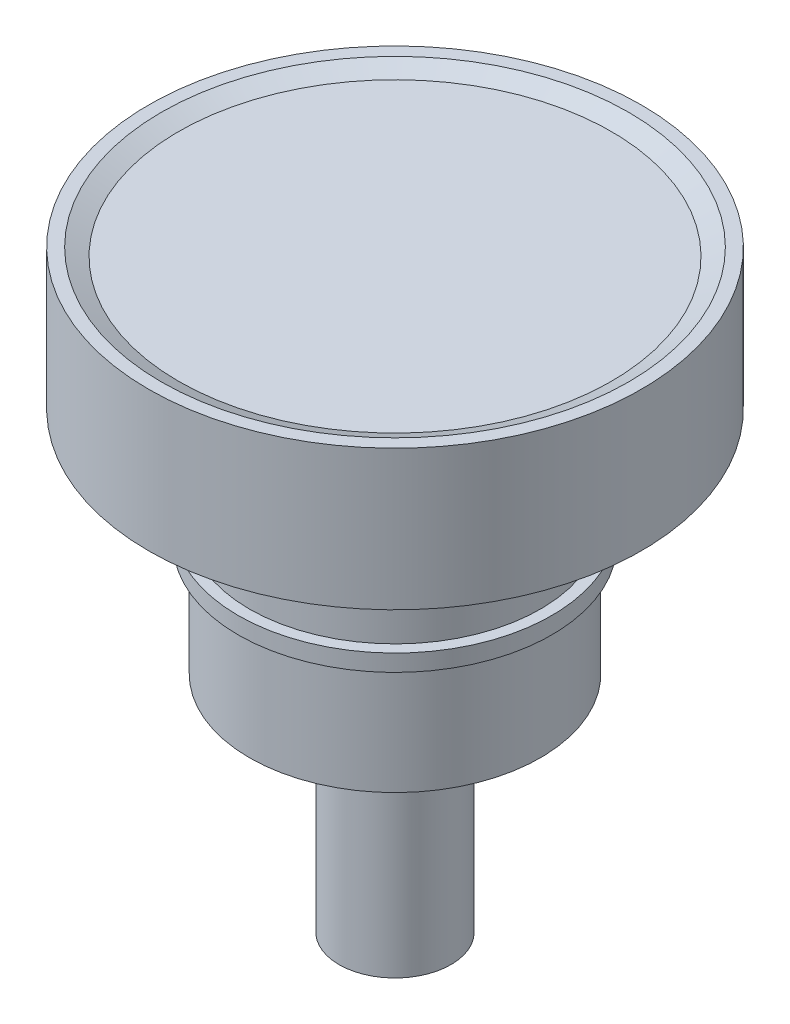
ISO-10303-21;
HEADER;
FILE_DESCRIPTION(('STEP AP214'),'2;1');
FILE_NAME('part.step','',(''),(''),'','','');
FILE_SCHEMA(('AUTOMOTIVE_DESIGN { 1 0 10303 214 1 1 1 1 }'));
ENDSEC;
DATA;
#1=APPLICATION_CONTEXT('core data for automotive mechanical design processes');
#2=APPLICATION_PROTOCOL_DEFINITION('international standard','automotive_design',2000,#1);
#3=PRODUCT_CONTEXT('',#1,'mechanical');
#4=PRODUCT('Part','Part','',(#3));
#5=PRODUCT_RELATED_PRODUCT_CATEGORY('part','',(#4));
#6=PRODUCT_DEFINITION_FORMATION('','',#4);
#7=PRODUCT_DEFINITION_CONTEXT('part definition',#1,'design');
#8=PRODUCT_DEFINITION('design','',#6,#7);
#9=PRODUCT_DEFINITION_SHAPE('','',#8);
#10=(LENGTH_UNIT() NAMED_UNIT(*) SI_UNIT(.MILLI.,.METRE.));
#11=(NAMED_UNIT(*) PLANE_ANGLE_UNIT() SI_UNIT($,.RADIAN.));
#12=(NAMED_UNIT(*) SI_UNIT($,.STERADIAN.) SOLID_ANGLE_UNIT());
#13=UNCERTAINTY_MEASURE_WITH_UNIT(LENGTH_MEASURE(1.E-05),#10,'distance_accuracy_value','');
#14=(GEOMETRIC_REPRESENTATION_CONTEXT(3) GLOBAL_UNCERTAINTY_ASSIGNED_CONTEXT((#13)) GLOBAL_UNIT_ASSIGNED_CONTEXT((#10,
#11,#12)) REPRESENTATION_CONTEXT('',''));
#15=CARTESIAN_POINT('',(0.,0.,0.));
#16=DIRECTION('',(0.,0.,1.));
#17=DIRECTION('',(1.,0.,0.));
#18=AXIS2_PLACEMENT_3D('',#15,#16,#17);
#19=CARTESIAN_POINT('',(0.,0.,0.));
#20=DIRECTION('',(0.,1.,0.));
#21=DIRECTION('',(0.,0.,1.));
#22=AXIS2_PLACEMENT_3D('',#19,#20,#21);
#23=PLANE('',#22);
#24=CARTESIAN_POINT('',(0.,0.,0.));
#25=DIRECTION('',(0.,1.,0.));
#26=DIRECTION('',(0.,0.,1.));
#27=AXIS2_PLACEMENT_3D('',#24,#25,#26);
#28=CIRCLE('',#27,5.);
#29=CARTESIAN_POINT('',(0.,0.,5.));
#30=VERTEX_POINT('',#29);
#31=EDGE_CURVE('E10',#30,#30,#28,.T.);
#32=ORIENTED_EDGE('',*,*,#31,.F.);
#33=EDGE_LOOP('',(#32));
#34=FACE_BOUND('',#33,.T.);
#35=ADVANCED_FACE('F36',(#34),#23,.F.);
#36=CARTESIAN_POINT('',(0.,52.2792518952472,0.));
#37=DIRECTION('',(0.,1.,0.));
#38=DIRECTION('',(0.,0.,1.));
#39=AXIS2_PLACEMENT_3D('',#36,#37,#38);
#40=CYLINDRICAL_SURFACE('',#39,5.);
#41=CARTESIAN_POINT('',(0.,20.,0.));
#42=DIRECTION('',(0.,1.,0.));
#43=DIRECTION('',(0.,0.,1.));
#44=AXIS2_PLACEMENT_3D('',#41,#42,#43);
#45=CIRCLE('',#44,5.);
#46=CARTESIAN_POINT('',(0.,20.,5.));
#47=VERTEX_POINT('',#46);
#48=EDGE_CURVE('E42',#47,#47,#45,.T.);
#49=ORIENTED_EDGE('',*,*,#48,.F.);
#50=EDGE_LOOP('',(#49));
#51=FACE_BOUND('',#50,.T.);
#52=ORIENTED_EDGE('',*,*,#31,.T.);
#53=EDGE_LOOP('',(#52));
#54=FACE_BOUND('',#53,.T.);
#55=ADVANCED_FACE('F138',(#51,#54),#40,.T.);
#56=CARTESIAN_POINT('',(5.,20.,0.));
#57=DIRECTION('',(0.,1.,0.));
#58=DIRECTION('',(0.,0.,1.));
#59=AXIS2_PLACEMENT_3D('',#56,#57,#58);
#60=PLANE('',#59);
#61=CARTESIAN_POINT('',(0.,20.,0.));
#62=DIRECTION('',(0.,1.,0.));
#63=DIRECTION('',(0.,0.,1.));
#64=AXIS2_PLACEMENT_3D('',#61,#62,#63);
#65=CIRCLE('',#64,13.);
#66=CARTESIAN_POINT('',(0.,20.,13.));
#67=VERTEX_POINT('',#66);
#68=EDGE_CURVE('E46',#67,#67,#65,.T.);
#69=ORIENTED_EDGE('',*,*,#68,.F.);
#70=EDGE_LOOP('',(#69));
#71=FACE_BOUND('',#70,.T.);
#72=ORIENTED_EDGE('',*,*,#48,.T.);
#73=EDGE_LOOP('',(#72));
#74=FACE_BOUND('',#73,.T.);
#75=ADVANCED_FACE('F133',(#71,#74),#60,.F.);
#76=CARTESIAN_POINT('',(0.,52.2792518952472,0.));
#77=DIRECTION('',(0.,1.,0.));
#78=DIRECTION('',(0.,0.,1.));
#79=AXIS2_PLACEMENT_3D('',#76,#77,#78);
#80=CYLINDRICAL_SURFACE('',#79,13.);
#81=CARTESIAN_POINT('',(0.,30.,0.));
#82=DIRECTION('',(0.,1.,0.));
#83=DIRECTION('',(0.,0.,1.));
#84=AXIS2_PLACEMENT_3D('',#81,#82,#83);
#85=CIRCLE('',#84,13.);
#86=CARTESIAN_POINT('',(0.,30.,13.));
#87=VERTEX_POINT('',#86);
#88=EDGE_CURVE('E50',#87,#87,#85,.T.);
#89=ORIENTED_EDGE('',*,*,#88,.F.);
#90=EDGE_LOOP('',(#89));
#91=FACE_BOUND('',#90,.T.);
#92=ORIENTED_EDGE('',*,*,#68,.T.);
#93=EDGE_LOOP('',(#92));
#94=FACE_BOUND('',#93,.T.);
#95=ADVANCED_FACE('F127',(#91,#94),#80,.T.);
#96=CARTESIAN_POINT('',(13.,30.,0.));
#97=DIRECTION('',(0.,1.,0.));
#98=DIRECTION('',(0.,0.,1.));
#99=AXIS2_PLACEMENT_3D('',#96,#97,#98);
#100=PLANE('',#99);
#101=CARTESIAN_POINT('',(0.,30.,0.));
#102=DIRECTION('',(0.,1.,0.));
#103=DIRECTION('',(0.,0.,1.));
#104=AXIS2_PLACEMENT_3D('',#101,#102,#103);
#105=CIRCLE('',#104,14.);
#106=CARTESIAN_POINT('',(0.,30.,14.));
#107=VERTEX_POINT('',#106);
#108=EDGE_CURVE('E55',#107,#107,#105,.T.);
#109=ORIENTED_EDGE('',*,*,#108,.F.);
#110=EDGE_LOOP('',(#109));
#111=FACE_BOUND('',#110,.T.);
#112=ORIENTED_EDGE('',*,*,#88,.T.);
#113=EDGE_LOOP('',(#112));
#114=FACE_BOUND('',#113,.T.);
#115=ADVANCED_FACE('F121',(#111,#114),#100,.F.);
#116=CARTESIAN_POINT('',(0.,52.2792518952472,0.));
#117=DIRECTION('',(0.,1.,0.));
#118=DIRECTION('',(0.,0.,1.));
#119=AXIS2_PLACEMENT_3D('',#116,#117,#118);
#120=CYLINDRICAL_SURFACE('',#119,14.);
#121=CARTESIAN_POINT('',(0.,31.5,0.));
#122=DIRECTION('',(0.,1.,0.));
#123=DIRECTION('',(0.,0.,1.));
#124=AXIS2_PLACEMENT_3D('',#121,#122,#123);
#125=CIRCLE('',#124,14.);
#126=CARTESIAN_POINT('',(0.,31.5,14.));
#127=VERTEX_POINT('',#126);
#128=EDGE_CURVE('E58',#127,#127,#125,.T.);
#129=ORIENTED_EDGE('',*,*,#128,.F.);
#130=EDGE_LOOP('',(#129));
#131=FACE_BOUND('',#130,.T.);
#132=ORIENTED_EDGE('',*,*,#108,.T.);
#133=EDGE_LOOP('',(#132));
#134=FACE_BOUND('',#133,.T.);
#135=ADVANCED_FACE('F115',(#131,#134),#120,.T.);
#136=CARTESIAN_POINT('',(14.,31.5,0.));
#137=DIRECTION('',(0.,-1.,0.));
#138=DIRECTION('',(0.,0.,-1.));
#139=AXIS2_PLACEMENT_3D('',#136,#137,#138);
#140=PLANE('',#139);
#141=CARTESIAN_POINT('',(0.,31.5,0.));
#142=DIRECTION('',(0.,1.,0.));
#143=DIRECTION('',(0.,0.,1.));
#144=AXIS2_PLACEMENT_3D('',#141,#142,#143);
#145=CIRCLE('',#144,13.);
#146=CARTESIAN_POINT('',(0.,31.5,13.));
#147=VERTEX_POINT('',#146);
#148=EDGE_CURVE('E61',#147,#147,#145,.T.);
#149=ORIENTED_EDGE('',*,*,#148,.F.);
#150=EDGE_LOOP('',(#149));
#151=FACE_BOUND('',#150,.T.);
#152=ORIENTED_EDGE('',*,*,#128,.T.);
#153=EDGE_LOOP('',(#152));
#154=FACE_BOUND('',#153,.T.);
#155=ADVANCED_FACE('F109',(#151,#154),#140,.F.);
#156=CARTESIAN_POINT('',(0.,52.2792518952472,0.));
#157=DIRECTION('',(0.,1.,0.));
#158=DIRECTION('',(0.,0.,1.));
#159=AXIS2_PLACEMENT_3D('',#156,#157,#158);
#160=CYLINDRICAL_SURFACE('',#159,13.);
#161=CARTESIAN_POINT('',(0.,40.5,0.));
#162=DIRECTION('',(0.,1.,0.));
#163=DIRECTION('',(0.,0.,1.));
#164=AXIS2_PLACEMENT_3D('',#161,#162,#163);
#165=CIRCLE('',#164,13.);
#166=CARTESIAN_POINT('',(0.,40.5,13.));
#167=VERTEX_POINT('',#166);
#168=EDGE_CURVE('E64',#167,#167,#165,.T.);
#169=ORIENTED_EDGE('',*,*,#168,.F.);
#170=EDGE_LOOP('',(#169));
#171=FACE_BOUND('',#170,.T.);
#172=ORIENTED_EDGE('',*,*,#148,.T.);
#173=EDGE_LOOP('',(#172));
#174=FACE_BOUND('',#173,.T.);
#175=ADVANCED_FACE('F103',(#171,#174),#160,.T.);
#176=CARTESIAN_POINT('',(13.,40.5,0.));
#177=DIRECTION('',(0.,1.,0.));
#178=DIRECTION('',(0.,0.,1.));
#179=AXIS2_PLACEMENT_3D('',#176,#177,#178);
#180=PLANE('',#179);
#181=CARTESIAN_POINT('',(0.,40.5,0.));
#182=DIRECTION('',(0.,1.,0.));
#183=DIRECTION('',(0.,0.,1.));
#184=AXIS2_PLACEMENT_3D('',#181,#182,#183);
#185=CIRCLE('',#184,22.);
#186=CARTESIAN_POINT('',(0.,40.5,22.));
#187=VERTEX_POINT('',#186);
#188=EDGE_CURVE('E67',#187,#187,#185,.T.);
#189=ORIENTED_EDGE('',*,*,#188,.F.);
#190=EDGE_LOOP('',(#189));
#191=FACE_BOUND('',#190,.T.);
#192=ORIENTED_EDGE('',*,*,#168,.T.);
#193=EDGE_LOOP('',(#192));
#194=FACE_BOUND('',#193,.T.);
#195=ADVANCED_FACE('F97',(#191,#194),#180,.F.);
#196=CARTESIAN_POINT('',(0.,52.2792518952472,0.));
#197=DIRECTION('',(0.,1.,0.));
#198=DIRECTION('',(0.,0.,1.));
#199=AXIS2_PLACEMENT_3D('',#196,#197,#198);
#200=CYLINDRICAL_SURFACE('',#199,22.);
#201=CARTESIAN_POINT('',(0.,53.,0.));
#202=DIRECTION('',(0.,1.,0.));
#203=DIRECTION('',(0.,0.,1.));
#204=AXIS2_PLACEMENT_3D('',#201,#202,#203);
#205=CIRCLE('',#204,22.);
#206=CARTESIAN_POINT('',(0.,53.,22.));
#207=VERTEX_POINT('',#206);
#208=EDGE_CURVE('E70',#207,#207,#205,.T.);
#209=ORIENTED_EDGE('',*,*,#208,.F.);
#210=EDGE_LOOP('',(#209));
#211=FACE_BOUND('',#210,.T.);
#212=ORIENTED_EDGE('',*,*,#188,.T.);
#213=EDGE_LOOP('',(#212));
#214=FACE_BOUND('',#213,.T.);
#215=ADVANCED_FACE('F91',(#211,#214),#200,.T.);
#216=CARTESIAN_POINT('',(22.,53.,0.));
#217=DIRECTION('',(0.,-1.,0.));
#218=DIRECTION('',(0.,0.,-1.));
#219=AXIS2_PLACEMENT_3D('',#216,#217,#218);
#220=PLANE('',#219);
#221=CARTESIAN_POINT('',(0.,53.,0.));
#222=DIRECTION('',(0.,1.,0.));
#223=DIRECTION('',(0.,0.,1.));
#224=AXIS2_PLACEMENT_3D('',#221,#222,#223);
#225=CIRCLE('',#224,20.8640082076457);
#226=CARTESIAN_POINT('',(0.,53.,20.8640082076457));
#227=VERTEX_POINT('',#226);
#228=EDGE_CURVE('E73',#227,#227,#225,.T.);
#229=ORIENTED_EDGE('',*,*,#228,.F.);
#230=EDGE_LOOP('',(#229));
#231=FACE_BOUND('',#230,.T.);
#232=ORIENTED_EDGE('',*,*,#208,.T.);
#233=EDGE_LOOP('',(#232));
#234=FACE_BOUND('',#233,.T.);
#235=ADVANCED_FACE('F85',(#231,#234),#220,.F.);
#236=CARTESIAN_POINT('',(0.,53.,0.));
#237=DIRECTION('',(0.,1.,0.));
#238=DIRECTION('',(0.,0.,1.));
#239=AXIS2_PLACEMENT_3D('',#236,#237,#238);
#240=CONICAL_SURFACE('',#239,20.8640082076457,1.13260509907731);
#241=CARTESIAN_POINT('',(0.,52.2792518952472,0.));
#242=DIRECTION('',(0.,1.,0.));
#243=DIRECTION('',(0.,0.,1.));
#244=AXIS2_PLACEMENT_3D('',#241,#242,#243);
#245=CIRCLE('',#244,19.3258306034649);
#246=CARTESIAN_POINT('',(0.,52.2792518952472,19.3258306034649));
#247=VERTEX_POINT('',#246);
#248=EDGE_CURVE('E76',#247,#247,#245,.T.);
#249=ORIENTED_EDGE('',*,*,#248,.F.);
#250=EDGE_LOOP('',(#249));
#251=FACE_BOUND('',#250,.T.);
#252=ORIENTED_EDGE('',*,*,#228,.T.);
#253=EDGE_LOOP('',(#252));
#254=FACE_BOUND('',#253,.T.);
#255=ADVANCED_FACE('F82',(#251,#254),#240,.F.);
#256=CARTESIAN_POINT('',(19.3258306034649,52.2792518952472,0.));
#257=DIRECTION('',(0.,-1.,0.));
#258=DIRECTION('',(0.,0.,-1.));
#259=AXIS2_PLACEMENT_3D('',#256,#257,#258);
#260=PLANE('',#259);
#261=ORIENTED_EDGE('',*,*,#248,.T.);
#262=EDGE_LOOP('',(#261));
#263=FACE_BOUND('',#262,.T.);
#264=ADVANCED_FACE('F80',(#263),#260,.F.);
#265=CLOSED_SHELL('',(#35,#55,#75,#95,#115,#135,#155,#175,#195,#215,#235,#255,#264));
#266=MANIFOLD_SOLID_BREP('B2',#265);
#267=ADVANCED_BREP_SHAPE_REPRESENTATION('',(#18,#266),#14);
#268=SHAPE_DEFINITION_REPRESENTATION(#9,#267);
ENDSEC;
END-ISO-10303-21;
